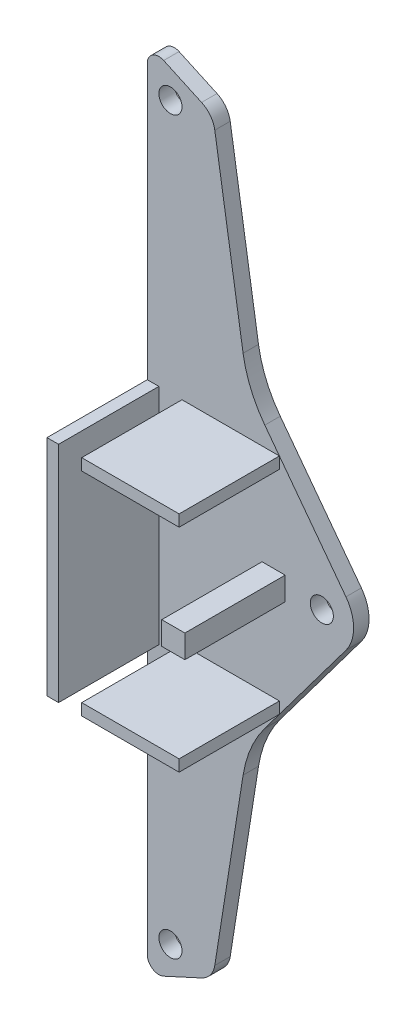
ISO-10303-21;
HEADER;
FILE_DESCRIPTION(('STEP AP214'),'2;1');
FILE_NAME('part.step','',(''),(''),'','','');
FILE_SCHEMA(('AUTOMOTIVE_DESIGN { 1 0 10303 214 1 1 1 1 }'));
ENDSEC;
DATA;
#1=APPLICATION_CONTEXT('core data for automotive mechanical design processes');
#2=APPLICATION_PROTOCOL_DEFINITION('international standard','automotive_design',2000,#1);
#3=PRODUCT_CONTEXT('',#1,'mechanical');
#4=PRODUCT('Part','Part','',(#3));
#5=PRODUCT_RELATED_PRODUCT_CATEGORY('part','',(#4));
#6=PRODUCT_DEFINITION_FORMATION('','',#4);
#7=PRODUCT_DEFINITION_CONTEXT('part definition',#1,'design');
#8=PRODUCT_DEFINITION('design','',#6,#7);
#9=PRODUCT_DEFINITION_SHAPE('','',#8);
#10=(LENGTH_UNIT() NAMED_UNIT(*) SI_UNIT(.MILLI.,.METRE.));
#11=(NAMED_UNIT(*) PLANE_ANGLE_UNIT() SI_UNIT($,.RADIAN.));
#12=(NAMED_UNIT(*) SI_UNIT($,.STERADIAN.) SOLID_ANGLE_UNIT());
#13=UNCERTAINTY_MEASURE_WITH_UNIT(LENGTH_MEASURE(1.E-05),#10,'distance_accuracy_value','');
#14=(GEOMETRIC_REPRESENTATION_CONTEXT(3) GLOBAL_UNCERTAINTY_ASSIGNED_CONTEXT((#13)) GLOBAL_UNIT_ASSIGNED_CONTEXT((#10,
#11,#12)) REPRESENTATION_CONTEXT('',''));
#15=CARTESIAN_POINT('',(0.,0.,0.));
#16=DIRECTION('',(0.,0.,1.));
#17=DIRECTION('',(1.,0.,0.));
#18=AXIS2_PLACEMENT_3D('',#15,#16,#17);
#19=CARTESIAN_POINT('',(0.,14.5,15.));
#20=DIRECTION('',(0.,-1.,0.));
#21=DIRECTION('',(1.,0.,0.));
#22=AXIS2_PLACEMENT_3D('',#19,#20,#21);
#23=PLANE('',#22);
#24=DIRECTION('',(-1.,0.,0.));
#25=VECTOR('',#24,1.);
#26=CARTESIAN_POINT('',(0.,14.5,15.));
#27=LINE('',#26,#25);
#28=CARTESIAN_POINT('',(1.50000000000001,14.5,15.));
#29=VERTEX_POINT('',#28);
#30=CARTESIAN_POINT('',(0.,14.5,15.));
#31=VERTEX_POINT('',#30);
#32=EDGE_CURVE('E530',#29,#31,#27,.T.);
#33=ORIENTED_EDGE('',*,*,#32,.F.);
#34=DIRECTION('',(0.,0.,1.));
#35=VECTOR('',#34,1.);
#36=CARTESIAN_POINT('',(1.50000000000001,14.5,-27.1547594742265));
#37=LINE('',#36,#35);
#38=CARTESIAN_POINT('',(1.50000000000001,14.5,2.));
#39=VERTEX_POINT('',#38);
#40=EDGE_CURVE('E275',#39,#29,#37,.T.);
#41=ORIENTED_EDGE('',*,*,#40,.F.);
#42=DIRECTION('',(-1.,0.,0.));
#43=VECTOR('',#42,1.);
#44=CARTESIAN_POINT('',(0.,14.5,2.));
#45=LINE('',#44,#43);
#46=CARTESIAN_POINT('',(0.,14.5,2.));
#47=VERTEX_POINT('',#46);
#48=EDGE_CURVE('E74',#39,#47,#45,.T.);
#49=ORIENTED_EDGE('',*,*,#48,.T.);
#50=DIRECTION('',(0.,0.,-1.));
#51=VECTOR('',#50,1.);
#52=CARTESIAN_POINT('',(0.,14.5,15.));
#53=LINE('',#52,#51);
#54=EDGE_CURVE('E333',#31,#47,#53,.T.);
#55=ORIENTED_EDGE('',*,*,#54,.F.);
#56=EDGE_LOOP('',(#33,#41,#49,#55));
#57=FACE_BOUND('',#56,.T.);
#58=ADVANCED_FACE('F70',(#57),#23,.F.);
#59=CARTESIAN_POINT('',(0.,-14.5,15.));
#60=DIRECTION('',(0.,-1.,0.));
#61=DIRECTION('',(0.,0.,-1.));
#62=AXIS2_PLACEMENT_3D('',#59,#60,#61);
#63=PLANE('',#62);
#64=DIRECTION('',(0.,0.,1.));
#65=VECTOR('',#64,1.);
#66=CARTESIAN_POINT('',(1.50000000000001,-14.5,-27.1547594742265));
#67=LINE('',#66,#65);
#68=CARTESIAN_POINT('',(1.50000000000001,-14.5,2.));
#69=VERTEX_POINT('',#68);
#70=CARTESIAN_POINT('',(1.50000000000001,-14.5,15.));
#71=VERTEX_POINT('',#70);
#72=EDGE_CURVE('E272',#69,#71,#67,.T.);
#73=ORIENTED_EDGE('',*,*,#72,.T.);
#74=DIRECTION('',(-1.,0.,0.));
#75=VECTOR('',#74,1.);
#76=CARTESIAN_POINT('',(0.,-14.5,15.));
#77=LINE('',#76,#75);
#78=CARTESIAN_POINT('',(0.,-14.5,15.));
#79=VERTEX_POINT('',#78);
#80=EDGE_CURVE('E285',#71,#79,#77,.T.);
#81=ORIENTED_EDGE('',*,*,#80,.T.);
#82=DIRECTION('',(0.,0.,-1.));
#83=VECTOR('',#82,1.);
#84=CARTESIAN_POINT('',(0.,-14.5,15.));
#85=LINE('',#84,#83);
#86=CARTESIAN_POINT('',(0.,-14.5,2.));
#87=VERTEX_POINT('',#86);
#88=EDGE_CURVE('E338',#79,#87,#85,.T.);
#89=ORIENTED_EDGE('',*,*,#88,.T.);
#90=DIRECTION('',(-1.,0.,0.));
#91=VECTOR('',#90,1.);
#92=CARTESIAN_POINT('',(0.,-14.5,2.));
#93=LINE('',#92,#91);
#94=EDGE_CURVE('E287',#69,#87,#93,.T.);
#95=ORIENTED_EDGE('',*,*,#94,.F.);
#96=EDGE_LOOP('',(#73,#81,#89,#95));
#97=FACE_BOUND('',#96,.T.);
#98=ADVANCED_FACE('F283',(#97),#63,.T.);
#99=CARTESIAN_POINT('',(0.,0.,15.));
#100=DIRECTION('',(0.,0.,1.));
#101=DIRECTION('',(1.,0.,0.));
#102=AXIS2_PLACEMENT_3D('',#99,#100,#101);
#103=PLANE('',#102);
#104=DIRECTION('',(0.,-1.,0.));
#105=VECTOR('',#104,1.);
#106=CARTESIAN_POINT('',(1.50000000000001,0.,15.));
#107=LINE('',#106,#105);
#108=EDGE_CURVE('E269',#29,#71,#107,.T.);
#109=ORIENTED_EDGE('',*,*,#108,.F.);
#110=ORIENTED_EDGE('',*,*,#32,.T.);
#111=DIRECTION('',(0.,-1.,0.));
#112=VECTOR('',#111,1.);
#113=CARTESIAN_POINT('',(0.,0.,15.));
#114=LINE('',#113,#112);
#115=EDGE_CURVE('E292',#31,#79,#114,.T.);
#116=ORIENTED_EDGE('',*,*,#115,.T.);
#117=ORIENTED_EDGE('',*,*,#80,.F.);
#118=EDGE_LOOP('',(#109,#110,#116,#117));
#119=FACE_BOUND('',#118,.T.);
#120=ADVANCED_FACE('F290',(#119),#103,.T.);
#121=DIRECTION('',(0.,1.,0.));
#122=VECTOR('',#121,1.);
#123=CARTESIAN_POINT('',(4.50000000000001,14.5,15.));
#124=LINE('',#123,#122);
#125=CARTESIAN_POINT('',(4.50000000000001,-14.5,15.));
#126=VERTEX_POINT('',#125);
#127=CARTESIAN_POINT('',(4.50000000000001,-13.,15.));
#128=VERTEX_POINT('',#127);
#129=EDGE_CURVE('E288',#126,#128,#124,.T.);
#130=ORIENTED_EDGE('',*,*,#129,.F.);
#131=CARTESIAN_POINT('',(17.125,-14.5,15.));
#132=VERTEX_POINT('',#131);
#133=EDGE_CURVE('E294',#132,#126,#77,.T.);
#134=ORIENTED_EDGE('',*,*,#133,.F.);
#135=DIRECTION('',(0.,-1.,0.));
#136=VECTOR('',#135,1.);
#137=CARTESIAN_POINT('',(17.125,0.,15.));
#138=LINE('',#137,#136);
#139=CARTESIAN_POINT('',(17.125,-13.,15.));
#140=VERTEX_POINT('',#139);
#141=EDGE_CURVE('E297',#140,#132,#138,.T.);
#142=ORIENTED_EDGE('',*,*,#141,.F.);
#143=DIRECTION('',(1.,0.,0.));
#144=VECTOR('',#143,1.);
#145=CARTESIAN_POINT('',(0.,-13.,15.));
#146=LINE('',#145,#144);
#147=EDGE_CURVE('E280',#128,#140,#146,.T.);
#148=ORIENTED_EDGE('',*,*,#147,.F.);
#149=EDGE_LOOP('',(#130,#134,#142,#148));
#150=FACE_BOUND('',#149,.T.);
#151=ADVANCED_FACE('F620',(#150),#103,.T.);
#152=CARTESIAN_POINT('',(0.,0.,2.));
#153=DIRECTION('',(0.,0.,1.));
#154=DIRECTION('',(1.,0.,0.));
#155=AXIS2_PLACEMENT_3D('',#152,#153,#154);
#156=PLANE('',#155);
#157=CARTESIAN_POINT('',(17.125,14.5,2.));
#158=VERTEX_POINT('',#157);
#159=CARTESIAN_POINT('',(4.50000000000001,14.5,2.));
#160=VERTEX_POINT('',#159);
#161=EDGE_CURVE('E319',#158,#160,#45,.T.);
#162=ORIENTED_EDGE('',*,*,#161,.F.);
#163=DIRECTION('',(-0.6,0.8,0.));
#164=VECTOR('',#163,1.);
#165=CARTESIAN_POINT('',(13.,20.,2.));
#166=LINE('',#165,#164);
#167=CARTESIAN_POINT('',(15.2347677564627,17.0203096580497,2.));
#168=VERTEX_POINT('',#167);
#169=EDGE_CURVE('E478',#158,#168,#166,.T.);
#170=ORIENTED_EDGE('',*,*,#169,.T.);
#171=CARTESIAN_POINT('',(27.2347677564627,26.0203096580497,2.));
#172=DIRECTION('',(0.,0.,1.));
#173=DIRECTION('',(1.,0.,0.));
#174=AXIS2_PLACEMENT_3D('',#171,#172,#173);
#175=CIRCLE('',#174,15.);
#176=CARTESIAN_POINT('',(12.4186251891815,23.6789597427239,2.));
#177=VERTEX_POINT('',#176);
#178=EDGE_CURVE('E434',#168,#177,#175,.F.);
#179=ORIENTED_EDGE('',*,*,#178,.T.);
#180=DIRECTION('',(-0.156089994355058,0.98774283781875,0.));
#181=VECTOR('',#180,1.);
#182=CARTESIAN_POINT('',(8.50000000000001,48.47615434,2.));
#183=LINE('',#182,#181);
#184=CARTESIAN_POINT('',(8.75094323647928,46.8881769327638,2.));
#185=VERTEX_POINT('',#184);
#186=EDGE_CURVE('E456',#177,#185,#183,.T.);
#187=ORIENTED_EDGE('',*,*,#186,.T.);
#188=CARTESIAN_POINT('',(5.78771472302303,46.4199069496986,2.));
#189=DIRECTION('',(0.,0.,1.));
#190=DIRECTION('',(1.,0.,0.));
#191=AXIS2_PLACEMENT_3D('',#188,#189,#190);
#192=CIRCLE('',#191,3.);
#193=CARTESIAN_POINT('',(7.03878332639954,49.1465949314167,2.));
#194=VERTEX_POINT('',#193);
#195=EDGE_CURVE('E420',#185,#194,#192,.T.);
#196=ORIENTED_EDGE('',*,*,#195,.T.);
#197=DIRECTION('',(-0.908895993906011,0.41702286779217,0.));
#198=VECTOR('',#197,1.);
#199=CARTESIAN_POINT('',(0.,52.37615434,2.));
#200=LINE('',#199,#198);
#201=CARTESIAN_POINT('',(2.12553430168827,51.4009091898136,2.));
#202=VERTEX_POINT('',#201);
#203=EDGE_CURVE('E375',#194,#202,#200,.T.);
#204=ORIENTED_EDGE('',*,*,#203,.T.);
#205=CARTESIAN_POINT('',(1.50000000000001,50.0375651989546,2.));
#206=DIRECTION('',(0.,0.,1.));
#207=DIRECTION('',(1.,0.,0.));
#208=AXIS2_PLACEMENT_3D('',#205,#206,#207);
#209=CIRCLE('',#208,1.5);
#210=CARTESIAN_POINT('',(0.,50.0375651989546,2.));
#211=VERTEX_POINT('',#210);
#212=EDGE_CURVE('E399',#202,#211,#209,.T.);
#213=ORIENTED_EDGE('',*,*,#212,.T.);
#214=DIRECTION('',(0.,-1.,0.));
#215=VECTOR('',#214,1.);
#216=CARTESIAN_POINT('',(0.,52.37615434,2.));
#217=LINE('',#216,#215);
#218=EDGE_CURVE('E383',#211,#47,#217,.T.);
#219=ORIENTED_EDGE('',*,*,#218,.T.);
#220=ORIENTED_EDGE('',*,*,#48,.F.);
#221=DIRECTION('',(0.,-1.,0.));
#222=VECTOR('',#221,1.);
#223=CARTESIAN_POINT('',(1.50000000000001,0.,2.));
#224=LINE('',#223,#222);
#225=EDGE_CURVE('E521',#39,#69,#224,.T.);
#226=ORIENTED_EDGE('',*,*,#225,.T.);
#227=ORIENTED_EDGE('',*,*,#94,.T.);
#228=CARTESIAN_POINT('',(0.,-50.0375651989546,2.));
#229=VERTEX_POINT('',#228);
#230=EDGE_CURVE('E328',#87,#229,#217,.T.);
#231=ORIENTED_EDGE('',*,*,#230,.T.);
#232=CARTESIAN_POINT('',(1.50000000000001,-50.0375651989546,2.));
#233=DIRECTION('',(0.,0.,1.));
#234=DIRECTION('',(1.,0.,0.));
#235=AXIS2_PLACEMENT_3D('',#232,#233,#234);
#236=CIRCLE('',#235,1.5);
#237=CARTESIAN_POINT('',(2.12553430168827,-51.4009091898136,2.));
#238=VERTEX_POINT('',#237);
#239=EDGE_CURVE('E397',#229,#238,#236,.T.);
#240=ORIENTED_EDGE('',*,*,#239,.T.);
#241=DIRECTION('',(0.908895993906011,0.41702286779217,0.));
#242=VECTOR('',#241,1.);
#243=CARTESIAN_POINT('',(0.,-52.37615434,2.));
#244=LINE('',#243,#242);
#245=CARTESIAN_POINT('',(7.03878332639954,-49.1465949314167,2.));
#246=VERTEX_POINT('',#245);
#247=EDGE_CURVE('E380',#238,#246,#244,.T.);
#248=ORIENTED_EDGE('',*,*,#247,.T.);
#249=CARTESIAN_POINT('',(5.78771472302303,-46.4199069496986,2.));
#250=DIRECTION('',(0.,0.,1.));
#251=DIRECTION('',(1.,0.,0.));
#252=AXIS2_PLACEMENT_3D('',#249,#250,#251);
#253=CIRCLE('',#252,3.);
#254=CARTESIAN_POINT('',(8.75094323647928,-46.8881769327638,2.));
#255=VERTEX_POINT('',#254);
#256=EDGE_CURVE('E422',#246,#255,#253,.T.);
#257=ORIENTED_EDGE('',*,*,#256,.T.);
#258=DIRECTION('',(0.156089994355058,0.98774283781875,0.));
#259=VECTOR('',#258,1.);
#260=CARTESIAN_POINT('',(8.50000000000001,-48.47615434,2.));
#261=LINE('',#260,#259);
#262=CARTESIAN_POINT('',(12.4186251891815,-23.6789597427239,2.));
#263=VERTEX_POINT('',#262);
#264=EDGE_CURVE('E482',#255,#263,#261,.T.);
#265=ORIENTED_EDGE('',*,*,#264,.T.);
#266=CARTESIAN_POINT('',(27.2347677564627,-26.0203096580497,2.));
#267=DIRECTION('',(0.,0.,1.));
#268=DIRECTION('',(1.,0.,0.));
#269=AXIS2_PLACEMENT_3D('',#266,#267,#268);
#270=CIRCLE('',#269,15.);
#271=CARTESIAN_POINT('',(15.2347677564627,-17.0203096580497,2.));
#272=VERTEX_POINT('',#271);
#273=EDGE_CURVE('E439',#263,#272,#270,.F.);
#274=ORIENTED_EDGE('',*,*,#273,.T.);
#275=DIRECTION('',(0.6,0.8,0.));
#276=VECTOR('',#275,1.);
#277=CARTESIAN_POINT('',(13.,-20.,2.));
#278=LINE('',#277,#276);
#279=CARTESIAN_POINT('',(17.125,-14.5,2.));
#280=VERTEX_POINT('',#279);
#281=EDGE_CURVE('E479',#272,#280,#278,.T.);
#282=ORIENTED_EDGE('',*,*,#281,.T.);
#283=CARTESIAN_POINT('',(4.50000000000001,-14.5,1.99999999999999));
#284=VERTEX_POINT('',#283);
#285=EDGE_CURVE('E317',#280,#284,#93,.T.);
#286=ORIENTED_EDGE('',*,*,#285,.T.);
#287=DIRECTION('',(0.,-1.,0.));
#288=VECTOR('',#287,1.);
#289=CARTESIAN_POINT('',(4.50000000000001,14.5,2.));
#290=LINE('',#289,#288);
#291=CARTESIAN_POINT('',(4.50000000000001,-13.,2.));
#292=VERTEX_POINT('',#291);
#293=EDGE_CURVE('E647',#292,#284,#290,.T.);
#294=ORIENTED_EDGE('',*,*,#293,.F.);
#295=DIRECTION('',(1.,0.,0.));
#296=VECTOR('',#295,1.);
#297=CARTESIAN_POINT('',(0.,-13.,2.));
#298=LINE('',#297,#296);
#299=CARTESIAN_POINT('',(17.125,-13.,2.));
#300=VERTEX_POINT('',#299);
#301=EDGE_CURVE('E313',#292,#300,#298,.T.);
#302=ORIENTED_EDGE('',*,*,#301,.T.);
#303=DIRECTION('',(0.,-1.,0.));
#304=VECTOR('',#303,1.);
#305=CARTESIAN_POINT('',(17.125,0.,2.));
#306=LINE('',#305,#304);
#307=EDGE_CURVE('E310',#300,#280,#306,.T.);
#308=ORIENTED_EDGE('',*,*,#307,.T.);
#309=CARTESIAN_POINT('',(25.75,-3.,2.));
#310=VERTEX_POINT('',#309);
#311=EDGE_CURVE('E481',#280,#310,#278,.T.);
#312=ORIENTED_EDGE('',*,*,#311,.T.);
#313=CARTESIAN_POINT('',(21.75,0.,2.));
#314=DIRECTION('',(0.,0.,1.));
#315=DIRECTION('',(1.,0.,0.));
#316=AXIS2_PLACEMENT_3D('',#313,#314,#315);
#317=CIRCLE('',#316,5.);
#318=CARTESIAN_POINT('',(25.75,3.,2.));
#319=VERTEX_POINT('',#318);
#320=EDGE_CURVE('E80',#310,#319,#317,.T.);
#321=ORIENTED_EDGE('',*,*,#320,.T.);
#322=EDGE_CURVE('E475',#319,#158,#166,.T.);
#323=ORIENTED_EDGE('',*,*,#322,.T.);
#324=CARTESIAN_POINT('',(17.125,13.,2.));
#325=VERTEX_POINT('',#324);
#326=EDGE_CURVE('E306',#158,#325,#306,.T.);
#327=ORIENTED_EDGE('',*,*,#326,.T.);
#328=DIRECTION('',(-1.,0.,0.));
#329=VECTOR('',#328,1.);
#330=CARTESIAN_POINT('',(0.,13.,2.));
#331=LINE('',#330,#329);
#332=CARTESIAN_POINT('',(4.50000000000001,13.,2.));
#333=VERTEX_POINT('',#332);
#334=EDGE_CURVE('E303',#325,#333,#331,.T.);
#335=ORIENTED_EDGE('',*,*,#334,.T.);
#336=EDGE_CURVE('E649',#160,#333,#290,.T.);
#337=ORIENTED_EDGE('',*,*,#336,.F.);
#338=EDGE_LOOP('',(#162,#170,#179,#187,#196,#204,#213,#219,#220,#226,#227,#231,#240,#248,#257,
#265,#274,#282,#286,#294,#302,#308,#312,#321,#323,#327,#335,#337));
#339=FACE_BOUND('',#338,.T.);
#340=CARTESIAN_POINT('',(3.,47.37615434,2.));
#341=DIRECTION('',(0.,0.,1.));
#342=DIRECTION('',(-1.,0.,0.));
#343=AXIS2_PLACEMENT_3D('',#340,#341,#342);
#344=CIRCLE('',#343,1.5);
#345=CARTESIAN_POINT('',(1.5,47.37615434,2.));
#346=VERTEX_POINT('',#345);
#347=EDGE_CURVE('E357',#346,#346,#344,.T.);
#348=ORIENTED_EDGE('',*,*,#347,.F.);
#349=EDGE_LOOP('',(#348));
#350=FACE_BOUND('',#349,.T.);
#351=CARTESIAN_POINT('',(3.,-47.37615434,2.));
#352=DIRECTION('',(0.,0.,1.));
#353=DIRECTION('',(1.,0.,0.));
#354=AXIS2_PLACEMENT_3D('',#351,#352,#353);
#355=CIRCLE('',#354,1.5);
#356=CARTESIAN_POINT('',(4.5,-47.37615434,2.));
#357=VERTEX_POINT('',#356);
#358=EDGE_CURVE('E369',#357,#357,#355,.T.);
#359=ORIENTED_EDGE('',*,*,#358,.F.);
#360=EDGE_LOOP('',(#359));
#361=FACE_BOUND('',#360,.T.);
#362=DIRECTION('',(-1.,0.,0.));
#363=VECTOR('',#362,1.);
#364=CARTESIAN_POINT('',(0.,-1.5,2.));
#365=LINE('',#364,#363);
#366=CARTESIAN_POINT('',(17.875,-1.5,2.));
#367=VERTEX_POINT('',#366);
#368=CARTESIAN_POINT('',(14.875,-1.5,2.));
#369=VERTEX_POINT('',#368);
#370=EDGE_CURVE('E661',#367,#369,#365,.T.);
#371=ORIENTED_EDGE('',*,*,#370,.T.);
#372=DIRECTION('',(0.,-1.,0.));
#373=VECTOR('',#372,1.);
#374=CARTESIAN_POINT('',(14.875,0.,2.));
#375=LINE('',#374,#373);
#376=CARTESIAN_POINT('',(14.875,1.5,2.));
#377=VERTEX_POINT('',#376);
#378=EDGE_CURVE('E666',#377,#369,#375,.T.);
#379=ORIENTED_EDGE('',*,*,#378,.F.);
#380=DIRECTION('',(-1.,0.,0.));
#381=VECTOR('',#380,1.);
#382=CARTESIAN_POINT('',(0.,1.5,2.));
#383=LINE('',#382,#381);
#384=CARTESIAN_POINT('',(17.875,1.5,2.));
#385=VERTEX_POINT('',#384);
#386=EDGE_CURVE('E679',#385,#377,#383,.T.);
#387=ORIENTED_EDGE('',*,*,#386,.F.);
#388=DIRECTION('',(0.,-1.,0.));
#389=VECTOR('',#388,1.);
#390=CARTESIAN_POINT('',(17.875,0.,2.));
#391=LINE('',#390,#389);
#392=EDGE_CURVE('E676',#385,#367,#391,.T.);
#393=ORIENTED_EDGE('',*,*,#392,.T.);
#394=EDGE_LOOP('',(#371,#379,#387,#393));
#395=FACE_BOUND('',#394,.T.);
#396=CARTESIAN_POINT('',(22.62384566,0.,2.));
#397=DIRECTION('',(0.,0.,1.));
#398=DIRECTION('',(1.,0.,0.));
#399=AXIS2_PLACEMENT_3D('',#396,#397,#398);
#400=CIRCLE('',#399,1.5);
#401=CARTESIAN_POINT('',(24.12384566,0.,2.));
#402=VERTEX_POINT('',#401);
#403=EDGE_CURVE('E363',#402,#402,#400,.T.);
#404=ORIENTED_EDGE('',*,*,#403,.F.);
#405=EDGE_LOOP('',(#404));
#406=FACE_BOUND('',#405,.T.);
#407=ADVANCED_FACE('F485',(#339,#350,#361,#395,#406),#156,.T.);
#408=CARTESIAN_POINT('',(0.,0.,0.));
#409=DIRECTION('',(0.,0.,1.));
#410=DIRECTION('',(1.,0.,0.));
#411=AXIS2_PLACEMENT_3D('',#408,#409,#410);
#412=PLANE('',#411);
#413=CARTESIAN_POINT('',(22.62384566,0.,0.));
#414=DIRECTION('',(0.,0.,1.));
#415=DIRECTION('',(1.,0.,0.));
#416=AXIS2_PLACEMENT_3D('',#413,#414,#415);
#417=CIRCLE('',#416,1.5);
#418=CARTESIAN_POINT('',(24.12384566,0.,0.));
#419=VERTEX_POINT('',#418);
#420=EDGE_CURVE('E360',#419,#419,#417,.T.);
#421=ORIENTED_EDGE('',*,*,#420,.T.);
#422=EDGE_LOOP('',(#421));
#423=FACE_BOUND('',#422,.T.);
#424=DIRECTION('',(-0.6,0.8,0.));
#425=VECTOR('',#424,1.);
#426=CARTESIAN_POINT('',(13.,20.,0.));
#427=LINE('',#426,#425);
#428=CARTESIAN_POINT('',(25.75,3.,0.));
#429=VERTEX_POINT('',#428);
#430=CARTESIAN_POINT('',(15.2347677564627,17.0203096580497,0.));
#431=VERTEX_POINT('',#430);
#432=EDGE_CURVE('E459',#429,#431,#427,.T.);
#433=ORIENTED_EDGE('',*,*,#432,.F.);
#434=CARTESIAN_POINT('',(21.75,0.,0.));
#435=DIRECTION('',(0.,0.,1.));
#436=DIRECTION('',(1.,0.,0.));
#437=AXIS2_PLACEMENT_3D('',#434,#435,#436);
#438=CIRCLE('',#437,5.);
#439=CARTESIAN_POINT('',(25.75,-3.,0.));
#440=VERTEX_POINT('',#439);
#441=EDGE_CURVE('E390',#429,#440,#438,.F.);
#442=ORIENTED_EDGE('',*,*,#441,.T.);
#443=DIRECTION('',(0.6,0.8,0.));
#444=VECTOR('',#443,1.);
#445=CARTESIAN_POINT('',(13.,-20.,0.));
#446=LINE('',#445,#444);
#447=CARTESIAN_POINT('',(15.2347677564627,-17.0203096580497,0.));
#448=VERTEX_POINT('',#447);
#449=EDGE_CURVE('E461',#448,#440,#446,.T.);
#450=ORIENTED_EDGE('',*,*,#449,.F.);
#451=CARTESIAN_POINT('',(27.2347677564627,-26.0203096580497,0.));
#452=DIRECTION('',(0.,0.,1.));
#453=DIRECTION('',(1.,0.,0.));
#454=AXIS2_PLACEMENT_3D('',#451,#452,#453);
#455=CIRCLE('',#454,15.);
#456=CARTESIAN_POINT('',(12.4186251891815,-23.6789597427239,0.));
#457=VERTEX_POINT('',#456);
#458=EDGE_CURVE('E441',#448,#457,#455,.T.);
#459=ORIENTED_EDGE('',*,*,#458,.T.);
#460=DIRECTION('',(0.156089994355058,0.98774283781875,0.));
#461=VECTOR('',#460,1.);
#462=CARTESIAN_POINT('',(8.50000000000001,-48.47615434,0.));
#463=LINE('',#462,#461);
#464=CARTESIAN_POINT('',(8.75094323647928,-46.8881769327638,0.));
#465=VERTEX_POINT('',#464);
#466=EDGE_CURVE('E464',#465,#457,#463,.T.);
#467=ORIENTED_EDGE('',*,*,#466,.F.);
#468=CARTESIAN_POINT('',(5.78771472302303,-46.4199069496986,0.));
#469=DIRECTION('',(0.,0.,1.));
#470=DIRECTION('',(1.,0.,0.));
#471=AXIS2_PLACEMENT_3D('',#468,#469,#470);
#472=CIRCLE('',#471,3.);
#473=CARTESIAN_POINT('',(7.03878332639954,-49.1465949314167,0.));
#474=VERTEX_POINT('',#473);
#475=EDGE_CURVE('E428',#465,#474,#472,.F.);
#476=ORIENTED_EDGE('',*,*,#475,.T.);
#477=DIRECTION('',(0.908895993906011,0.41702286779217,0.));
#478=VECTOR('',#477,1.);
#479=CARTESIAN_POINT('',(0.,-52.37615434,0.));
#480=LINE('',#479,#478);
#481=CARTESIAN_POINT('',(2.12553430168827,-51.4009091898136,0.));
#482=VERTEX_POINT('',#481);
#483=EDGE_CURVE('E466',#482,#474,#480,.T.);
#484=ORIENTED_EDGE('',*,*,#483,.F.);
#485=CARTESIAN_POINT('',(1.50000000000001,-50.0375651989546,0.));
#486=DIRECTION('',(0.,0.,1.));
#487=DIRECTION('',(1.,0.,0.));
#488=AXIS2_PLACEMENT_3D('',#485,#486,#487);
#489=CIRCLE('',#488,1.5);
#490=CARTESIAN_POINT('',(0.,-50.0375651989546,0.));
#491=VERTEX_POINT('',#490);
#492=EDGE_CURVE('E407',#482,#491,#489,.F.);
#493=ORIENTED_EDGE('',*,*,#492,.T.);
#494=DIRECTION('',(0.,-1.,0.));
#495=VECTOR('',#494,1.);
#496=CARTESIAN_POINT('',(0.,52.37615434,0.));
#497=LINE('',#496,#495);
#498=CARTESIAN_POINT('',(0.,50.0375651989546,0.));
#499=VERTEX_POINT('',#498);
#500=EDGE_CURVE('E468',#499,#491,#497,.T.);
#501=ORIENTED_EDGE('',*,*,#500,.F.);
#502=CARTESIAN_POINT('',(1.50000000000001,50.0375651989546,0.));
#503=DIRECTION('',(0.,0.,1.));
#504=DIRECTION('',(1.,0.,0.));
#505=AXIS2_PLACEMENT_3D('',#502,#503,#504);
#506=CIRCLE('',#505,1.5);
#507=CARTESIAN_POINT('',(2.12553430168827,51.4009091898136,0.));
#508=VERTEX_POINT('',#507);
#509=EDGE_CURVE('E409',#499,#508,#506,.F.);
#510=ORIENTED_EDGE('',*,*,#509,.T.);
#511=DIRECTION('',(-0.908895993906011,0.41702286779217,0.));
#512=VECTOR('',#511,1.);
#513=CARTESIAN_POINT('',(0.,52.37615434,0.));
#514=LINE('',#513,#512);
#515=CARTESIAN_POINT('',(7.03878332639954,49.1465949314167,0.));
#516=VERTEX_POINT('',#515);
#517=EDGE_CURVE('E372',#516,#508,#514,.T.);
#518=ORIENTED_EDGE('',*,*,#517,.F.);
#519=CARTESIAN_POINT('',(5.78771472302303,46.4199069496986,0.));
#520=DIRECTION('',(0.,0.,1.));
#521=DIRECTION('',(1.,0.,0.));
#522=AXIS2_PLACEMENT_3D('',#519,#520,#521);
#523=CIRCLE('',#522,3.);
#524=CARTESIAN_POINT('',(8.75094323647928,46.8881769327638,0.));
#525=VERTEX_POINT('',#524);
#526=EDGE_CURVE('E426',#516,#525,#523,.F.);
#527=ORIENTED_EDGE('',*,*,#526,.T.);
#528=DIRECTION('',(-0.156089994355058,0.98774283781875,0.));
#529=VECTOR('',#528,1.);
#530=CARTESIAN_POINT('',(8.50000000000001,48.47615434,0.));
#531=LINE('',#530,#529);
#532=CARTESIAN_POINT('',(12.4186251891815,23.6789597427239,0.));
#533=VERTEX_POINT('',#532);
#534=EDGE_CURVE('E377',#533,#525,#531,.T.);
#535=ORIENTED_EDGE('',*,*,#534,.F.);
#536=CARTESIAN_POINT('',(27.2347677564627,26.0203096580497,0.));
#537=DIRECTION('',(0.,0.,1.));
#538=DIRECTION('',(1.,0.,0.));
#539=AXIS2_PLACEMENT_3D('',#536,#537,#538);
#540=CIRCLE('',#539,15.);
#541=EDGE_CURVE('E436',#533,#431,#540,.T.);
#542=ORIENTED_EDGE('',*,*,#541,.T.);
#543=EDGE_LOOP('',(#433,#442,#450,#459,#467,#476,#484,#493,#501,#510,#518,#527,#535,#542));
#544=FACE_BOUND('',#543,.T.);
#545=CARTESIAN_POINT('',(3.,-47.37615434,0.));
#546=DIRECTION('',(0.,0.,1.));
#547=DIRECTION('',(1.,0.,0.));
#548=AXIS2_PLACEMENT_3D('',#545,#546,#547);
#549=CIRCLE('',#548,1.5);
#550=CARTESIAN_POINT('',(4.5,-47.37615434,0.));
#551=VERTEX_POINT('',#550);
#552=EDGE_CURVE('E366',#551,#551,#549,.T.);
#553=ORIENTED_EDGE('',*,*,#552,.T.);
#554=EDGE_LOOP('',(#553));
#555=FACE_BOUND('',#554,.T.);
#556=CARTESIAN_POINT('',(3.,47.37615434,0.));
#557=DIRECTION('',(0.,0.,1.));
#558=DIRECTION('',(-1.,0.,0.));
#559=AXIS2_PLACEMENT_3D('',#556,#557,#558);
#560=CIRCLE('',#559,1.5);
#561=CARTESIAN_POINT('',(1.5,47.37615434,0.));
#562=VERTEX_POINT('',#561);
#563=EDGE_CURVE('E356',#562,#562,#560,.T.);
#564=ORIENTED_EDGE('',*,*,#563,.T.);
#565=EDGE_LOOP('',(#564));
#566=FACE_BOUND('',#565,.T.);
#567=ADVANCED_FACE('F502',(#423,#544,#555,#566),#412,.F.);
#568=CARTESIAN_POINT('',(0.,52.37615434,2.));
#569=DIRECTION('',(-0.41702286779217,-0.908895993906011,0.));
#570=DIRECTION('',(0.908895993906011,-0.41702286779217,0.));
#571=AXIS2_PLACEMENT_3D('',#568,#569,#570);
#572=PLANE('',#571);
#573=ORIENTED_EDGE('',*,*,#517,.T.);
#574=DIRECTION('',(0.,0.,-1.));
#575=VECTOR('',#574,1.);
#576=CARTESIAN_POINT('',(2.12553430168827,51.4009091898136,2.));
#577=LINE('',#576,#575);
#578=EDGE_CURVE('E395',#508,#202,#577,.F.);
#579=ORIENTED_EDGE('',*,*,#578,.T.);
#580=ORIENTED_EDGE('',*,*,#203,.F.);
#581=DIRECTION('',(0.,0.,-1.));
#582=VECTOR('',#581,1.);
#583=CARTESIAN_POINT('',(7.03878332639954,49.1465949314167,2.));
#584=LINE('',#583,#582);
#585=EDGE_CURVE('E431',#194,#516,#584,.T.);
#586=ORIENTED_EDGE('',*,*,#585,.T.);
#587=EDGE_LOOP('',(#573,#579,#580,#586));
#588=FACE_BOUND('',#587,.T.);
#589=ADVANCED_FACE('F552',(#588),#572,.F.);
#590=CARTESIAN_POINT('',(0.,52.37615434,2.));
#591=DIRECTION('',(1.,0.,0.));
#592=DIRECTION('',(0.,0.,-1.));
#593=AXIS2_PLACEMENT_3D('',#590,#591,#592);
#594=PLANE('',#593);
#595=ORIENTED_EDGE('',*,*,#500,.T.);
#596=DIRECTION('',(0.,0.,-1.));
#597=VECTOR('',#596,1.);
#598=CARTESIAN_POINT('',(0.,-50.0375651989546,2.));
#599=LINE('',#598,#597);
#600=EDGE_CURVE('E401',#491,#229,#599,.F.);
#601=ORIENTED_EDGE('',*,*,#600,.T.);
#602=ORIENTED_EDGE('',*,*,#230,.F.);
#603=ORIENTED_EDGE('',*,*,#88,.F.);
#604=ORIENTED_EDGE('',*,*,#115,.F.);
#605=ORIENTED_EDGE('',*,*,#54,.T.);
#606=ORIENTED_EDGE('',*,*,#218,.F.);
#607=DIRECTION('',(0.,0.,-1.));
#608=VECTOR('',#607,1.);
#609=CARTESIAN_POINT('',(0.,50.0375651989546,2.));
#610=LINE('',#609,#608);
#611=EDGE_CURVE('E404',#211,#499,#610,.T.);
#612=ORIENTED_EDGE('',*,*,#611,.T.);
#613=EDGE_LOOP('',(#595,#601,#602,#603,#604,#605,#606,#612));
#614=FACE_BOUND('',#613,.T.);
#615=ADVANCED_FACE('F542',(#614),#594,.F.);
#616=CARTESIAN_POINT('',(0.,-52.37615434,2.));
#617=DIRECTION('',(-0.41702286779217,0.908895993906011,0.));
#618=DIRECTION('',(-0.908895993906011,-0.41702286779217,0.));
#619=AXIS2_PLACEMENT_3D('',#616,#617,#618);
#620=PLANE('',#619);
#621=ORIENTED_EDGE('',*,*,#247,.F.);
#622=DIRECTION('',(0.,0.,-1.));
#623=VECTOR('',#622,1.);
#624=CARTESIAN_POINT('',(2.12553430168827,-51.4009091898136,2.));
#625=LINE('',#624,#623);
#626=EDGE_CURVE('E411',#238,#482,#625,.T.);
#627=ORIENTED_EDGE('',*,*,#626,.T.);
#628=ORIENTED_EDGE('',*,*,#483,.T.);
#629=DIRECTION('',(0.,0.,-1.));
#630=VECTOR('',#629,1.);
#631=CARTESIAN_POINT('',(7.03878332639954,-49.1465949314167,2.));
#632=LINE('',#631,#630);
#633=EDGE_CURVE('E414',#474,#246,#632,.F.);
#634=ORIENTED_EDGE('',*,*,#633,.T.);
#635=EDGE_LOOP('',(#621,#627,#628,#634));
#636=FACE_BOUND('',#635,.T.);
#637=ADVANCED_FACE('F492',(#636),#620,.F.);
#638=CARTESIAN_POINT('',(8.50000000000001,-48.47615434,2.));
#639=DIRECTION('',(-0.98774283781875,0.156089994355058,0.));
#640=DIRECTION('',(-0.156089994355058,-0.98774283781875,0.));
#641=AXIS2_PLACEMENT_3D('',#638,#639,#640);
#642=PLANE('',#641);
#643=ORIENTED_EDGE('',*,*,#264,.F.);
#644=DIRECTION('',(0.,0.,-1.));
#645=VECTOR('',#644,1.);
#646=CARTESIAN_POINT('',(8.75094323647928,-46.8881769327638,2.));
#647=LINE('',#646,#645);
#648=EDGE_CURVE('E417',#255,#465,#647,.T.);
#649=ORIENTED_EDGE('',*,*,#648,.T.);
#650=ORIENTED_EDGE('',*,*,#466,.T.);
#651=DIRECTION('',(0.,0.,-1.));
#652=VECTOR('',#651,1.);
#653=CARTESIAN_POINT('',(12.4186251891815,-23.6789597427239,2.));
#654=LINE('',#653,#652);
#655=EDGE_CURVE('E450',#457,#263,#654,.F.);
#656=ORIENTED_EDGE('',*,*,#655,.T.);
#657=EDGE_LOOP('',(#643,#649,#650,#656));
#658=FACE_BOUND('',#657,.T.);
#659=ADVANCED_FACE('F499',(#658),#642,.F.);
#660=CARTESIAN_POINT('',(13.,-20.,2.));
#661=DIRECTION('',(-0.8,0.6,0.));
#662=DIRECTION('',(-0.6,-0.8,0.));
#663=AXIS2_PLACEMENT_3D('',#660,#661,#662);
#664=PLANE('',#663);
#665=ORIENTED_EDGE('',*,*,#449,.T.);
#666=DIRECTION('',(0.,0.,-1.));
#667=VECTOR('',#666,1.);
#668=CARTESIAN_POINT('',(25.75,-3.,2.));
#669=LINE('',#668,#667);
#670=EDGE_CURVE('E387',#440,#310,#669,.F.);
#671=ORIENTED_EDGE('',*,*,#670,.T.);
#672=ORIENTED_EDGE('',*,*,#311,.F.);
#673=ORIENTED_EDGE('',*,*,#281,.F.);
#674=DIRECTION('',(0.,0.,-1.));
#675=VECTOR('',#674,1.);
#676=CARTESIAN_POINT('',(15.2347677564627,-17.0203096580497,0.));
#677=LINE('',#676,#675);
#678=EDGE_CURVE('E453',#272,#448,#677,.T.);
#679=ORIENTED_EDGE('',*,*,#678,.T.);
#680=EDGE_LOOP('',(#665,#671,#672,#673,#679));
#681=FACE_BOUND('',#680,.T.);
#682=ADVANCED_FACE('F513',(#681),#664,.F.);
#683=CARTESIAN_POINT('',(13.,20.,2.));
#684=DIRECTION('',(-0.8,-0.6,0.));
#685=DIRECTION('',(0.6,-0.8,0.));
#686=AXIS2_PLACEMENT_3D('',#683,#684,#685);
#687=PLANE('',#686);
#688=ORIENTED_EDGE('',*,*,#322,.F.);
#689=DIRECTION('',(0.,0.,-1.));
#690=VECTOR('',#689,1.);
#691=CARTESIAN_POINT('',(25.75,3.,2.));
#692=LINE('',#691,#690);
#693=EDGE_CURVE('E392',#319,#429,#692,.T.);
#694=ORIENTED_EDGE('',*,*,#693,.T.);
#695=ORIENTED_EDGE('',*,*,#432,.T.);
#696=DIRECTION('',(0.,0.,-1.));
#697=VECTOR('',#696,1.);
#698=CARTESIAN_POINT('',(15.2347677564627,17.0203096580497,2.));
#699=LINE('',#698,#697);
#700=EDGE_CURVE('E444',#431,#168,#699,.F.);
#701=ORIENTED_EDGE('',*,*,#700,.T.);
#702=ORIENTED_EDGE('',*,*,#169,.F.);
#703=EDGE_LOOP('',(#688,#694,#695,#701,#702));
#704=FACE_BOUND('',#703,.T.);
#705=ADVANCED_FACE('F571',(#704),#687,.F.);
#706=CARTESIAN_POINT('',(8.50000000000001,48.47615434,2.));
#707=DIRECTION('',(-0.98774283781875,-0.156089994355058,0.));
#708=DIRECTION('',(0.156089994355058,-0.98774283781875,0.));
#709=AXIS2_PLACEMENT_3D('',#706,#707,#708);
#710=PLANE('',#709);
#711=ORIENTED_EDGE('',*,*,#534,.T.);
#712=DIRECTION('',(0.,0.,-1.));
#713=VECTOR('',#712,1.);
#714=CARTESIAN_POINT('',(8.75094323647928,46.8881769327638,2.));
#715=LINE('',#714,#713);
#716=EDGE_CURVE('E424',#525,#185,#715,.F.);
#717=ORIENTED_EDGE('',*,*,#716,.T.);
#718=ORIENTED_EDGE('',*,*,#186,.F.);
#719=DIRECTION('',(0.,0.,-1.));
#720=VECTOR('',#719,1.);
#721=CARTESIAN_POINT('',(12.4186251891815,23.6789597427239,0.));
#722=LINE('',#721,#720);
#723=EDGE_CURVE('E447',#177,#533,#722,.T.);
#724=ORIENTED_EDGE('',*,*,#723,.T.);
#725=EDGE_LOOP('',(#711,#717,#718,#724));
#726=FACE_BOUND('',#725,.T.);
#727=ADVANCED_FACE('F563',(#726),#710,.F.);
#728=CARTESIAN_POINT('',(3.,-47.37615434,2.));
#729=DIRECTION('',(0.,0.,-1.));
#730=DIRECTION('',(-1.,0.,0.));
#731=AXIS2_PLACEMENT_3D('',#728,#729,#730);
#732=CYLINDRICAL_SURFACE('',#731,1.5);
#733=ORIENTED_EDGE('',*,*,#358,.T.);
#734=EDGE_LOOP('',(#733));
#735=FACE_BOUND('',#734,.T.);
#736=ORIENTED_EDGE('',*,*,#552,.F.);
#737=EDGE_LOOP('',(#736));
#738=FACE_BOUND('',#737,.T.);
#739=ADVANCED_FACE('F707',(#735,#738),#732,.F.);
#740=CARTESIAN_POINT('',(22.62384566,0.,2.));
#741=DIRECTION('',(0.,0.,-1.));
#742=DIRECTION('',(-1.,0.,0.));
#743=AXIS2_PLACEMENT_3D('',#740,#741,#742);
#744=CYLINDRICAL_SURFACE('',#743,1.5);
#745=ORIENTED_EDGE('',*,*,#403,.T.);
#746=EDGE_LOOP('',(#745));
#747=FACE_BOUND('',#746,.T.);
#748=ORIENTED_EDGE('',*,*,#420,.F.);
#749=EDGE_LOOP('',(#748));
#750=FACE_BOUND('',#749,.T.);
#751=ADVANCED_FACE('F703',(#747,#750),#744,.F.);
#752=CARTESIAN_POINT('',(3.,47.37615434,2.));
#753=DIRECTION('',(0.,0.,-1.));
#754=DIRECTION('',(-1.,0.,0.));
#755=AXIS2_PLACEMENT_3D('',#752,#753,#754);
#756=CYLINDRICAL_SURFACE('',#755,1.5);
#757=ORIENTED_EDGE('',*,*,#347,.T.);
#758=EDGE_LOOP('',(#757));
#759=FACE_BOUND('',#758,.T.);
#760=ORIENTED_EDGE('',*,*,#563,.F.);
#761=EDGE_LOOP('',(#760));
#762=FACE_BOUND('',#761,.T.);
#763=ADVANCED_FACE('F706',(#759,#762),#756,.F.);
#764=CARTESIAN_POINT('',(27.2347677564627,-26.0203096580497,2.));
#765=DIRECTION('',(0.,0.,1.));
#766=DIRECTION('',(1.,0.,0.));
#767=AXIS2_PLACEMENT_3D('',#764,#765,#766);
#768=CYLINDRICAL_SURFACE('',#767,15.);
#769=ORIENTED_EDGE('',*,*,#273,.F.);
#770=ORIENTED_EDGE('',*,*,#655,.F.);
#771=ORIENTED_EDGE('',*,*,#458,.F.);
#772=ORIENTED_EDGE('',*,*,#678,.F.);
#773=EDGE_LOOP('',(#769,#770,#771,#772));
#774=FACE_BOUND('',#773,.T.);
#775=ADVANCED_FACE('F509',(#774),#768,.F.);
#776=CARTESIAN_POINT('',(27.2347677564627,26.0203096580497,2.));
#777=DIRECTION('',(0.,0.,1.));
#778=DIRECTION('',(1.,0.,0.));
#779=AXIS2_PLACEMENT_3D('',#776,#777,#778);
#780=CYLINDRICAL_SURFACE('',#779,15.);
#781=ORIENTED_EDGE('',*,*,#178,.F.);
#782=ORIENTED_EDGE('',*,*,#700,.F.);
#783=ORIENTED_EDGE('',*,*,#541,.F.);
#784=ORIENTED_EDGE('',*,*,#723,.F.);
#785=EDGE_LOOP('',(#781,#782,#783,#784));
#786=FACE_BOUND('',#785,.T.);
#787=ADVANCED_FACE('F568',(#786),#780,.F.);
#788=CARTESIAN_POINT('',(5.78771472302303,46.4199069496986,2.));
#789=DIRECTION('',(0.,0.,-1.));
#790=DIRECTION('',(-1.,0.,0.));
#791=AXIS2_PLACEMENT_3D('',#788,#789,#790);
#792=CYLINDRICAL_SURFACE('',#791,3.);
#793=ORIENTED_EDGE('',*,*,#195,.F.);
#794=ORIENTED_EDGE('',*,*,#716,.F.);
#795=ORIENTED_EDGE('',*,*,#526,.F.);
#796=ORIENTED_EDGE('',*,*,#585,.F.);
#797=EDGE_LOOP('',(#793,#794,#795,#796));
#798=FACE_BOUND('',#797,.T.);
#799=ADVANCED_FACE('F559',(#798),#792,.T.);
#800=CARTESIAN_POINT('',(5.78771472302303,-46.4199069496986,2.));
#801=DIRECTION('',(0.,0.,-1.));
#802=DIRECTION('',(-1.,0.,0.));
#803=AXIS2_PLACEMENT_3D('',#800,#801,#802);
#804=CYLINDRICAL_SURFACE('',#803,3.);
#805=ORIENTED_EDGE('',*,*,#256,.F.);
#806=ORIENTED_EDGE('',*,*,#633,.F.);
#807=ORIENTED_EDGE('',*,*,#475,.F.);
#808=ORIENTED_EDGE('',*,*,#648,.F.);
#809=EDGE_LOOP('',(#805,#806,#807,#808));
#810=FACE_BOUND('',#809,.T.);
#811=ADVANCED_FACE('F496',(#810),#804,.T.);
#812=CARTESIAN_POINT('',(1.50000000000001,-50.0375651989546,2.));
#813=DIRECTION('',(0.,0.,-1.));
#814=DIRECTION('',(-1.,0.,0.));
#815=AXIS2_PLACEMENT_3D('',#812,#813,#814);
#816=CYLINDRICAL_SURFACE('',#815,1.5);
#817=ORIENTED_EDGE('',*,*,#239,.F.);
#818=ORIENTED_EDGE('',*,*,#600,.F.);
#819=ORIENTED_EDGE('',*,*,#492,.F.);
#820=ORIENTED_EDGE('',*,*,#626,.F.);
#821=EDGE_LOOP('',(#817,#818,#819,#820));
#822=FACE_BOUND('',#821,.T.);
#823=ADVANCED_FACE('F546',(#822),#816,.T.);
#824=CARTESIAN_POINT('',(1.50000000000001,50.0375651989546,2.));
#825=DIRECTION('',(0.,0.,-1.));
#826=DIRECTION('',(-1.,0.,0.));
#827=AXIS2_PLACEMENT_3D('',#824,#825,#826);
#828=CYLINDRICAL_SURFACE('',#827,1.5);
#829=ORIENTED_EDGE('',*,*,#212,.F.);
#830=ORIENTED_EDGE('',*,*,#578,.F.);
#831=ORIENTED_EDGE('',*,*,#509,.F.);
#832=ORIENTED_EDGE('',*,*,#611,.F.);
#833=EDGE_LOOP('',(#829,#830,#831,#832));
#834=FACE_BOUND('',#833,.T.);
#835=ADVANCED_FACE('F556',(#834),#828,.T.);
#836=CARTESIAN_POINT('',(21.75,0.,2.));
#837=DIRECTION('',(0.,0.,-1.));
#838=DIRECTION('',(-1.,0.,0.));
#839=AXIS2_PLACEMENT_3D('',#836,#837,#838);
#840=CYLINDRICAL_SURFACE('',#839,5.);
#841=ORIENTED_EDGE('',*,*,#320,.F.);
#842=ORIENTED_EDGE('',*,*,#670,.F.);
#843=ORIENTED_EDGE('',*,*,#441,.F.);
#844=ORIENTED_EDGE('',*,*,#693,.F.);
#845=EDGE_LOOP('',(#841,#842,#843,#844));
#846=FACE_BOUND('',#845,.T.);
#847=ADVANCED_FACE('F72',(#846),#840,.T.);
#848=CARTESIAN_POINT('',(0.,13.,15.));
#849=DIRECTION('',(0.,-1.,0.));
#850=DIRECTION('',(0.,0.,-1.));
#851=AXIS2_PLACEMENT_3D('',#848,#849,#850);
#852=PLANE('',#851);
#853=DIRECTION('',(0.,0.,1.));
#854=VECTOR('',#853,1.);
#855=CARTESIAN_POINT('',(4.50000000000001,13.,15.));
#856=LINE('',#855,#854);
#857=CARTESIAN_POINT('',(4.50000000000001,13.,15.));
#858=VERTEX_POINT('',#857);
#859=EDGE_CURVE('E95',#333,#858,#856,.T.);
#860=ORIENTED_EDGE('',*,*,#859,.F.);
#861=ORIENTED_EDGE('',*,*,#334,.F.);
#862=DIRECTION('',(0.,0.,-1.));
#863=VECTOR('',#862,1.);
#864=CARTESIAN_POINT('',(17.125,13.,15.));
#865=LINE('',#864,#863);
#866=CARTESIAN_POINT('',(17.125,13.,15.));
#867=VERTEX_POINT('',#866);
#868=EDGE_CURVE('E353',#867,#325,#865,.T.);
#869=ORIENTED_EDGE('',*,*,#868,.F.);
#870=DIRECTION('',(-1.,0.,0.));
#871=VECTOR('',#870,1.);
#872=CARTESIAN_POINT('',(0.,13.,15.));
#873=LINE('',#872,#871);
#874=EDGE_CURVE('E522',#867,#858,#873,.T.);
#875=ORIENTED_EDGE('',*,*,#874,.T.);
#876=EDGE_LOOP('',(#860,#861,#869,#875));
#877=FACE_BOUND('',#876,.T.);
#878=ADVANCED_FACE('F576',(#877),#852,.T.);
#879=CARTESIAN_POINT('',(17.125,0.,15.));
#880=DIRECTION('',(1.,0.,0.));
#881=DIRECTION('',(0.,0.,-1.));
#882=AXIS2_PLACEMENT_3D('',#879,#880,#881);
#883=PLANE('',#882);
#884=ORIENTED_EDGE('',*,*,#326,.F.);
#885=DIRECTION('',(0.,0.,-1.));
#886=VECTOR('',#885,1.);
#887=CARTESIAN_POINT('',(17.125,14.5,15.));
#888=LINE('',#887,#886);
#889=CARTESIAN_POINT('',(17.125,14.5,15.));
#890=VERTEX_POINT('',#889);
#891=EDGE_CURVE('E337',#890,#158,#888,.T.);
#892=ORIENTED_EDGE('',*,*,#891,.F.);
#893=EDGE_CURVE('E525',#890,#867,#138,.T.);
#894=ORIENTED_EDGE('',*,*,#893,.T.);
#895=ORIENTED_EDGE('',*,*,#868,.T.);
#896=EDGE_LOOP('',(#884,#892,#894,#895));
#897=FACE_BOUND('',#896,.T.);
#898=ADVANCED_FACE('F581',(#897),#883,.T.);
#899=ORIENTED_EDGE('',*,*,#161,.T.);
#900=DIRECTION('',(0.,0.,1.));
#901=VECTOR('',#900,1.);
#902=CARTESIAN_POINT('',(4.50000000000001,14.5,-27.1547594742265));
#903=LINE('',#902,#901);
#904=CARTESIAN_POINT('',(4.50000000000001,14.5,15.));
#905=VERTEX_POINT('',#904);
#906=EDGE_CURVE('E655',#160,#905,#903,.T.);
#907=ORIENTED_EDGE('',*,*,#906,.T.);
#908=EDGE_CURVE('E298',#890,#905,#27,.T.);
#909=ORIENTED_EDGE('',*,*,#908,.F.);
#910=ORIENTED_EDGE('',*,*,#891,.T.);
#911=EDGE_LOOP('',(#899,#907,#909,#910));
#912=FACE_BOUND('',#911,.T.);
#913=ADVANCED_FACE('F585',(#912),#23,.F.);
#914=DIRECTION('',(0.,0.,1.));
#915=VECTOR('',#914,1.);
#916=CARTESIAN_POINT('',(4.50000000000001,-14.5,-27.1547594742265));
#917=LINE('',#916,#915);
#918=EDGE_CURVE('E88',#284,#126,#917,.T.);
#919=ORIENTED_EDGE('',*,*,#918,.F.);
#920=ORIENTED_EDGE('',*,*,#285,.F.);
#921=DIRECTION('',(0.,0.,-1.));
#922=VECTOR('',#921,1.);
#923=CARTESIAN_POINT('',(17.125,-14.5,15.));
#924=LINE('',#923,#922);
#925=EDGE_CURVE('E341',#132,#280,#924,.T.);
#926=ORIENTED_EDGE('',*,*,#925,.F.);
#927=ORIENTED_EDGE('',*,*,#133,.T.);
#928=EDGE_LOOP('',(#919,#920,#926,#927));
#929=FACE_BOUND('',#928,.T.);
#930=ADVANCED_FACE('F590',(#929),#63,.T.);
#931=ORIENTED_EDGE('',*,*,#307,.F.);
#932=DIRECTION('',(0.,0.,-1.));
#933=VECTOR('',#932,1.);
#934=CARTESIAN_POINT('',(17.125,-13.,15.));
#935=LINE('',#934,#933);
#936=EDGE_CURVE('E279',#140,#300,#935,.T.);
#937=ORIENTED_EDGE('',*,*,#936,.F.);
#938=ORIENTED_EDGE('',*,*,#141,.T.);
#939=ORIENTED_EDGE('',*,*,#925,.T.);
#940=EDGE_LOOP('',(#931,#937,#938,#939));
#941=FACE_BOUND('',#940,.T.);
#942=ADVANCED_FACE('F596',(#941),#883,.T.);
#943=CARTESIAN_POINT('',(0.,-13.,15.));
#944=DIRECTION('',(0.,1.,0.));
#945=DIRECTION('',(-1.,0.,0.));
#946=AXIS2_PLACEMENT_3D('',#943,#944,#945);
#947=PLANE('',#946);
#948=DIRECTION('',(0.,0.,-1.));
#949=VECTOR('',#948,1.);
#950=CARTESIAN_POINT('',(4.50000000000001,-13.,15.));
#951=LINE('',#950,#949);
#952=EDGE_CURVE('E646',#128,#292,#951,.T.);
#953=ORIENTED_EDGE('',*,*,#952,.F.);
#954=ORIENTED_EDGE('',*,*,#147,.T.);
#955=ORIENTED_EDGE('',*,*,#936,.T.);
#956=ORIENTED_EDGE('',*,*,#301,.F.);
#957=EDGE_LOOP('',(#953,#954,#955,#956));
#958=FACE_BOUND('',#957,.T.);
#959=ADVANCED_FACE('F605',(#958),#947,.T.);
#960=CARTESIAN_POINT('',(1.50000000000001,0.,15.));
#961=DIRECTION('',(1.,0.,0.));
#962=DIRECTION('',(0.,1.,0.));
#963=AXIS2_PLACEMENT_3D('',#960,#961,#962);
#964=PLANE('',#963);
#965=ORIENTED_EDGE('',*,*,#225,.F.);
#966=ORIENTED_EDGE('',*,*,#40,.T.);
#967=ORIENTED_EDGE('',*,*,#108,.T.);
#968=ORIENTED_EDGE('',*,*,#72,.F.);
#969=EDGE_LOOP('',(#965,#966,#967,#968));
#970=FACE_BOUND('',#969,.T.);
#971=ADVANCED_FACE('F271',(#970),#964,.T.);
#972=DIRECTION('',(0.,1.,0.));
#973=VECTOR('',#972,1.);
#974=CARTESIAN_POINT('',(4.50000000000001,0.,15.));
#975=LINE('',#974,#973);
#976=EDGE_CURVE('E12',#858,#905,#975,.T.);
#977=ORIENTED_EDGE('',*,*,#976,.F.);
#978=ORIENTED_EDGE('',*,*,#874,.F.);
#979=ORIENTED_EDGE('',*,*,#893,.F.);
#980=ORIENTED_EDGE('',*,*,#908,.T.);
#981=EDGE_LOOP('',(#977,#978,#979,#980));
#982=FACE_BOUND('',#981,.T.);
#983=ADVANCED_FACE('F613',(#982),#103,.T.);
#984=CARTESIAN_POINT('',(0.,-1.5,15.));
#985=DIRECTION('',(0.,-1.,0.));
#986=DIRECTION('',(1.,0.,0.));
#987=AXIS2_PLACEMENT_3D('',#984,#985,#986);
#988=PLANE('',#987);
#989=ORIENTED_EDGE('',*,*,#370,.F.);
#990=DIRECTION('',(0.,0.,-1.));
#991=VECTOR('',#990,1.);
#992=CARTESIAN_POINT('',(17.875,-1.5,15.));
#993=LINE('',#992,#991);
#994=CARTESIAN_POINT('',(17.875,-1.5,15.));
#995=VERTEX_POINT('',#994);
#996=EDGE_CURVE('E307',#995,#367,#993,.T.);
#997=ORIENTED_EDGE('',*,*,#996,.F.);
#998=DIRECTION('',(-1.,0.,0.));
#999=VECTOR('',#998,1.);
#1000=CARTESIAN_POINT('',(0.,-1.5,15.));
#1001=LINE('',#1000,#999);
#1002=CARTESIAN_POINT('',(14.875,-1.5,15.));
#1003=VERTEX_POINT('',#1002);
#1004=EDGE_CURVE('E662',#995,#1003,#1001,.T.);
#1005=ORIENTED_EDGE('',*,*,#1004,.T.);
#1006=DIRECTION('',(0.,0.,-1.));
#1007=VECTOR('',#1006,1.);
#1008=CARTESIAN_POINT('',(14.875,-1.5,15.));
#1009=LINE('',#1008,#1007);
#1010=EDGE_CURVE('E673',#1003,#369,#1009,.T.);
#1011=ORIENTED_EDGE('',*,*,#1010,.T.);
#1012=EDGE_LOOP('',(#989,#997,#1005,#1011));
#1013=FACE_BOUND('',#1012,.T.);
#1014=ADVANCED_FACE('F619',(#1013),#988,.T.);
#1015=CARTESIAN_POINT('',(17.875,0.,15.));
#1016=DIRECTION('',(1.,0.,0.));
#1017=DIRECTION('',(0.,0.,-1.));
#1018=AXIS2_PLACEMENT_3D('',#1015,#1016,#1017);
#1019=PLANE('',#1018);
#1020=ORIENTED_EDGE('',*,*,#392,.F.);
#1021=DIRECTION('',(0.,0.,-1.));
#1022=VECTOR('',#1021,1.);
#1023=CARTESIAN_POINT('',(17.875,1.5,15.));
#1024=LINE('',#1023,#1022);
#1025=CARTESIAN_POINT('',(17.875,1.5,15.));
#1026=VERTEX_POINT('',#1025);
#1027=EDGE_CURVE('E686',#1026,#385,#1024,.T.);
#1028=ORIENTED_EDGE('',*,*,#1027,.F.);
#1029=DIRECTION('',(0.,-1.,0.));
#1030=VECTOR('',#1029,1.);
#1031=CARTESIAN_POINT('',(17.875,0.,15.));
#1032=LINE('',#1031,#1030);
#1033=EDGE_CURVE('E665',#1026,#995,#1032,.T.);
#1034=ORIENTED_EDGE('',*,*,#1033,.T.);
#1035=ORIENTED_EDGE('',*,*,#996,.T.);
#1036=EDGE_LOOP('',(#1020,#1028,#1034,#1035));
#1037=FACE_BOUND('',#1036,.T.);
#1038=ADVANCED_FACE('F623',(#1037),#1019,.T.);
#1039=CARTESIAN_POINT('',(0.,1.5,15.));
#1040=DIRECTION('',(0.,-1.,0.));
#1041=DIRECTION('',(1.,0.,0.));
#1042=AXIS2_PLACEMENT_3D('',#1039,#1040,#1041);
#1043=PLANE('',#1042);
#1044=ORIENTED_EDGE('',*,*,#386,.T.);
#1045=DIRECTION('',(0.,0.,-1.));
#1046=VECTOR('',#1045,1.);
#1047=CARTESIAN_POINT('',(14.875,1.5,15.));
#1048=LINE('',#1047,#1046);
#1049=CARTESIAN_POINT('',(14.875,1.5,15.));
#1050=VERTEX_POINT('',#1049);
#1051=EDGE_CURVE('E685',#1050,#377,#1048,.T.);
#1052=ORIENTED_EDGE('',*,*,#1051,.F.);
#1053=DIRECTION('',(-1.,0.,0.));
#1054=VECTOR('',#1053,1.);
#1055=CARTESIAN_POINT('',(0.,1.5,15.));
#1056=LINE('',#1055,#1054);
#1057=EDGE_CURVE('E669',#1026,#1050,#1056,.T.);
#1058=ORIENTED_EDGE('',*,*,#1057,.F.);
#1059=ORIENTED_EDGE('',*,*,#1027,.T.);
#1060=EDGE_LOOP('',(#1044,#1052,#1058,#1059));
#1061=FACE_BOUND('',#1060,.T.);
#1062=ADVANCED_FACE('F627',(#1061),#1043,.F.);
#1063=CARTESIAN_POINT('',(14.875,0.,15.));
#1064=DIRECTION('',(1.,0.,0.));
#1065=DIRECTION('',(0.,0.,-1.));
#1066=AXIS2_PLACEMENT_3D('',#1063,#1064,#1065);
#1067=PLANE('',#1066);
#1068=ORIENTED_EDGE('',*,*,#378,.T.);
#1069=ORIENTED_EDGE('',*,*,#1010,.F.);
#1070=DIRECTION('',(0.,-1.,0.));
#1071=VECTOR('',#1070,1.);
#1072=CARTESIAN_POINT('',(14.875,0.,15.));
#1073=LINE('',#1072,#1071);
#1074=EDGE_CURVE('E671',#1050,#1003,#1073,.T.);
#1075=ORIENTED_EDGE('',*,*,#1074,.F.);
#1076=ORIENTED_EDGE('',*,*,#1051,.T.);
#1077=EDGE_LOOP('',(#1068,#1069,#1075,#1076));
#1078=FACE_BOUND('',#1077,.T.);
#1079=ADVANCED_FACE('F631',(#1078),#1067,.F.);
#1080=CARTESIAN_POINT('',(0.,0.,15.));
#1081=DIRECTION('',(0.,0.,1.));
#1082=DIRECTION('',(1.,0.,0.));
#1083=AXIS2_PLACEMENT_3D('',#1080,#1081,#1082);
#1084=PLANE('',#1083);
#1085=ORIENTED_EDGE('',*,*,#1004,.F.);
#1086=ORIENTED_EDGE('',*,*,#1033,.F.);
#1087=ORIENTED_EDGE('',*,*,#1057,.T.);
#1088=ORIENTED_EDGE('',*,*,#1074,.T.);
#1089=EDGE_LOOP('',(#1085,#1086,#1087,#1088));
#1090=FACE_BOUND('',#1089,.T.);
#1091=ADVANCED_FACE('F635',(#1090),#1084,.T.);
#1092=CARTESIAN_POINT('',(4.50000000000001,14.5,-27.1547594742265));
#1093=DIRECTION('',(1.,0.,0.));
#1094=DIRECTION('',(0.,0.,-1.));
#1095=AXIS2_PLACEMENT_3D('',#1092,#1093,#1094);
#1096=PLANE('',#1095);
#1097=ORIENTED_EDGE('',*,*,#859,.T.);
#1098=ORIENTED_EDGE('',*,*,#976,.T.);
#1099=ORIENTED_EDGE('',*,*,#906,.F.);
#1100=ORIENTED_EDGE('',*,*,#336,.T.);
#1101=EDGE_LOOP('',(#1097,#1098,#1099,#1100));
#1102=FACE_BOUND('',#1101,.T.);
#1103=ADVANCED_FACE('F639',(#1102),#1096,.F.);
#1104=ORIENTED_EDGE('',*,*,#952,.T.);
#1105=ORIENTED_EDGE('',*,*,#293,.T.);
#1106=ORIENTED_EDGE('',*,*,#918,.T.);
#1107=ORIENTED_EDGE('',*,*,#129,.T.);
#1108=EDGE_LOOP('',(#1104,#1105,#1106,#1107));
#1109=FACE_BOUND('',#1108,.T.);
#1110=ADVANCED_FACE('F641',(#1109),#1096,.F.);
#1111=CLOSED_SHELL('',(#58,#98,#120,#151,#407,#567,#589,#615,#637,#659,#682,#705,#727,#739,#751,
#763,#775,#787,#799,#811,#823,#835,#847,#878,#898,#913,#930,#942,#959,#971,#983,#1014,#1038,
#1062,#1079,#1091,#1103,#1110));
#1112=MANIFOLD_SOLID_BREP('B2',#1111);
#1113=ADVANCED_BREP_SHAPE_REPRESENTATION('',(#18,#1112),#14);
#1114=SHAPE_DEFINITION_REPRESENTATION(#9,#1113);
ENDSEC;
END-ISO-10303-21;
